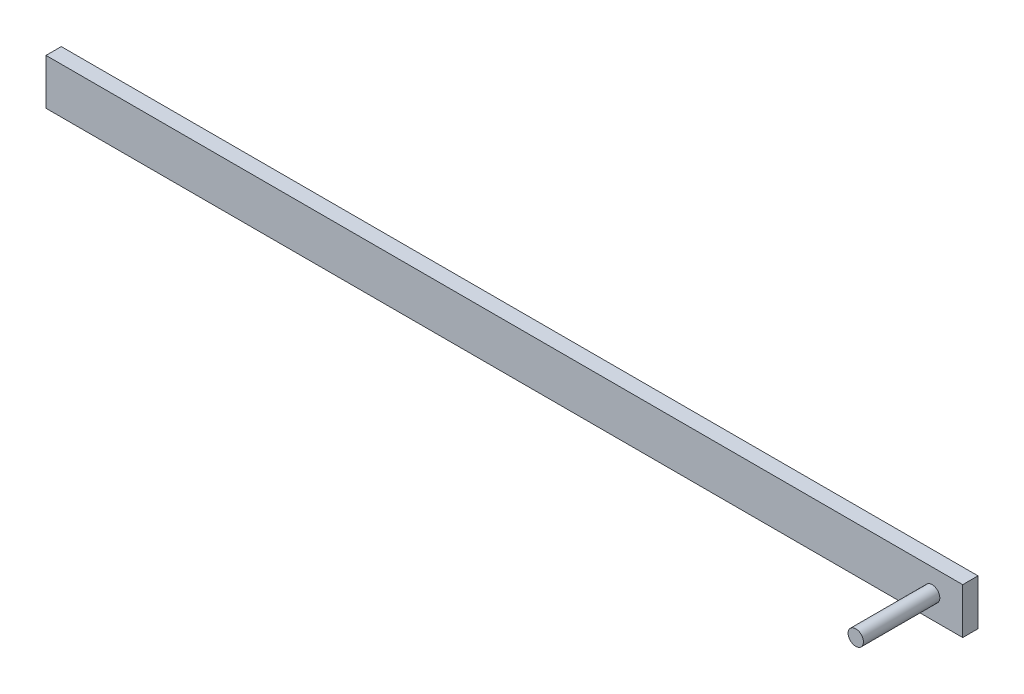
ISO-10303-21;
HEADER;
FILE_DESCRIPTION(('STEP AP214'),'2;1');
FILE_NAME('part.step','',(''),(''),'','','');
FILE_SCHEMA(('AUTOMOTIVE_DESIGN { 1 0 10303 214 1 1 1 1 }'));
ENDSEC;
DATA;
#1=APPLICATION_CONTEXT('core data for automotive mechanical design processes');
#2=APPLICATION_PROTOCOL_DEFINITION('international standard','automotive_design',2000,#1);
#3=PRODUCT_CONTEXT('',#1,'mechanical');
#4=PRODUCT('Part','Part','',(#3));
#5=PRODUCT_RELATED_PRODUCT_CATEGORY('part','',(#4));
#6=PRODUCT_DEFINITION_FORMATION('','',#4);
#7=PRODUCT_DEFINITION_CONTEXT('part definition',#1,'design');
#8=PRODUCT_DEFINITION('design','',#6,#7);
#9=PRODUCT_DEFINITION_SHAPE('','',#8);
#10=(LENGTH_UNIT() NAMED_UNIT(*) SI_UNIT(.MILLI.,.METRE.));
#11=(NAMED_UNIT(*) PLANE_ANGLE_UNIT() SI_UNIT($,.RADIAN.));
#12=(NAMED_UNIT(*) SI_UNIT($,.STERADIAN.) SOLID_ANGLE_UNIT());
#13=UNCERTAINTY_MEASURE_WITH_UNIT(LENGTH_MEASURE(1.E-05),#10,'distance_accuracy_value','');
#14=(GEOMETRIC_REPRESENTATION_CONTEXT(3) GLOBAL_UNCERTAINTY_ASSIGNED_CONTEXT((#13)) GLOBAL_UNIT_ASSIGNED_CONTEXT((#10,
#11,#12)) REPRESENTATION_CONTEXT('',''));
#15=CARTESIAN_POINT('',(0.,0.,0.));
#16=DIRECTION('',(0.,0.,1.));
#17=DIRECTION('',(1.,0.,0.));
#18=AXIS2_PLACEMENT_3D('',#15,#16,#17);
#19=CARTESIAN_POINT('',(-300.,-15.,10.));
#20=DIRECTION('',(0.,1.,0.));
#21=DIRECTION('',(0.,0.,1.));
#22=AXIS2_PLACEMENT_3D('',#19,#20,#21);
#23=PLANE('',#22);
#24=DIRECTION('',(1.,0.,0.));
#25=VECTOR('',#24,1.);
#26=CARTESIAN_POINT('',(-300.,-15.,0.));
#27=LINE('',#26,#25);
#28=CARTESIAN_POINT('',(-300.,-15.,0.));
#29=VERTEX_POINT('',#28);
#30=CARTESIAN_POINT('',(300.,-15.,0.));
#31=VERTEX_POINT('',#30);
#32=EDGE_CURVE('E109',#29,#31,#27,.T.);
#33=ORIENTED_EDGE('',*,*,#32,.T.);
#34=DIRECTION('',(0.,0.,-1.));
#35=VECTOR('',#34,1.);
#36=CARTESIAN_POINT('',(300.,-15.,10.));
#37=LINE('',#36,#35);
#38=CARTESIAN_POINT('',(300.,-15.,10.));
#39=VERTEX_POINT('',#38);
#40=EDGE_CURVE('E11',#39,#31,#37,.T.);
#41=ORIENTED_EDGE('',*,*,#40,.F.);
#42=DIRECTION('',(1.,0.,0.));
#43=VECTOR('',#42,1.);
#44=CARTESIAN_POINT('',(-300.,-15.,10.));
#45=LINE('',#44,#43);
#46=CARTESIAN_POINT('',(-300.,-15.,10.));
#47=VERTEX_POINT('',#46);
#48=EDGE_CURVE('E93',#47,#39,#45,.T.);
#49=ORIENTED_EDGE('',*,*,#48,.F.);
#50=DIRECTION('',(0.,0.,-1.));
#51=VECTOR('',#50,1.);
#52=CARTESIAN_POINT('',(-300.,-15.,10.));
#53=LINE('',#52,#51);
#54=EDGE_CURVE('E105',#47,#29,#53,.T.);
#55=ORIENTED_EDGE('',*,*,#54,.T.);
#56=EDGE_LOOP('',(#33,#41,#49,#55));
#57=FACE_BOUND('',#56,.T.);
#58=ADVANCED_FACE('F41',(#57),#23,.F.);
#59=CARTESIAN_POINT('',(300.,-15.,10.));
#60=DIRECTION('',(-1.,0.,0.));
#61=DIRECTION('',(0.,0.,1.));
#62=AXIS2_PLACEMENT_3D('',#59,#60,#61);
#63=PLANE('',#62);
#64=DIRECTION('',(0.,1.,0.));
#65=VECTOR('',#64,1.);
#66=CARTESIAN_POINT('',(300.,-15.,0.));
#67=LINE('',#66,#65);
#68=CARTESIAN_POINT('',(300.,15.,0.));
#69=VERTEX_POINT('',#68);
#70=EDGE_CURVE('E98',#31,#69,#67,.T.);
#71=ORIENTED_EDGE('',*,*,#70,.T.);
#72=DIRECTION('',(0.,0.,-1.));
#73=VECTOR('',#72,1.);
#74=CARTESIAN_POINT('',(300.,15.,10.));
#75=LINE('',#74,#73);
#76=CARTESIAN_POINT('',(300.,15.,10.));
#77=VERTEX_POINT('',#76);
#78=EDGE_CURVE('E50',#77,#69,#75,.T.);
#79=ORIENTED_EDGE('',*,*,#78,.F.);
#80=DIRECTION('',(0.,1.,0.));
#81=VECTOR('',#80,1.);
#82=CARTESIAN_POINT('',(300.,-15.,10.));
#83=LINE('',#82,#81);
#84=EDGE_CURVE('E88',#39,#77,#83,.T.);
#85=ORIENTED_EDGE('',*,*,#84,.F.);
#86=ORIENTED_EDGE('',*,*,#40,.T.);
#87=EDGE_LOOP('',(#71,#79,#85,#86));
#88=FACE_BOUND('',#87,.T.);
#89=ADVANCED_FACE('F97',(#88),#63,.F.);
#90=CARTESIAN_POINT('',(-300.,15.,10.));
#91=DIRECTION('',(0.,-1.,0.));
#92=DIRECTION('',(0.,0.,-1.));
#93=AXIS2_PLACEMENT_3D('',#90,#91,#92);
#94=PLANE('',#93);
#95=DIRECTION('',(-1.,0.,0.));
#96=VECTOR('',#95,1.);
#97=CARTESIAN_POINT('',(-300.,15.,0.));
#98=LINE('',#97,#96);
#99=CARTESIAN_POINT('',(-300.,15.,0.));
#100=VERTEX_POINT('',#99);
#101=EDGE_CURVE('E75',#69,#100,#98,.T.);
#102=ORIENTED_EDGE('',*,*,#101,.T.);
#103=DIRECTION('',(0.,0.,-1.));
#104=VECTOR('',#103,1.);
#105=CARTESIAN_POINT('',(-300.,15.,10.));
#106=LINE('',#105,#104);
#107=CARTESIAN_POINT('',(-300.,15.,10.));
#108=VERTEX_POINT('',#107);
#109=EDGE_CURVE('E100',#108,#100,#106,.T.);
#110=ORIENTED_EDGE('',*,*,#109,.F.);
#111=DIRECTION('',(-1.,0.,0.));
#112=VECTOR('',#111,1.);
#113=CARTESIAN_POINT('',(-300.,15.,10.));
#114=LINE('',#113,#112);
#115=EDGE_CURVE('E91',#77,#108,#114,.T.);
#116=ORIENTED_EDGE('',*,*,#115,.F.);
#117=ORIENTED_EDGE('',*,*,#78,.T.);
#118=EDGE_LOOP('',(#102,#110,#116,#117));
#119=FACE_BOUND('',#118,.T.);
#120=ADVANCED_FACE('F101',(#119),#94,.F.);
#121=CARTESIAN_POINT('',(-300.,-15.,10.));
#122=DIRECTION('',(1.,0.,0.));
#123=DIRECTION('',(0.,0.,-1.));
#124=AXIS2_PLACEMENT_3D('',#121,#122,#123);
#125=PLANE('',#124);
#126=DIRECTION('',(0.,-1.,0.));
#127=VECTOR('',#126,1.);
#128=CARTESIAN_POINT('',(-300.,-15.,0.));
#129=LINE('',#128,#127);
#130=EDGE_CURVE('E81',#100,#29,#129,.T.);
#131=ORIENTED_EDGE('',*,*,#130,.T.);
#132=ORIENTED_EDGE('',*,*,#54,.F.);
#133=DIRECTION('',(0.,-1.,0.));
#134=VECTOR('',#133,1.);
#135=CARTESIAN_POINT('',(-300.,-15.,10.));
#136=LINE('',#135,#134);
#137=EDGE_CURVE('E58',#108,#47,#136,.T.);
#138=ORIENTED_EDGE('',*,*,#137,.F.);
#139=ORIENTED_EDGE('',*,*,#109,.T.);
#140=EDGE_LOOP('',(#131,#132,#138,#139));
#141=FACE_BOUND('',#140,.T.);
#142=ADVANCED_FACE('F123',(#141),#125,.F.);
#143=CARTESIAN_POINT('',(0.,0.,10.));
#144=DIRECTION('',(0.,0.,1.));
#145=DIRECTION('',(1.,0.,0.));
#146=AXIS2_PLACEMENT_3D('',#143,#144,#145);
#147=PLANE('',#146);
#148=CARTESIAN_POINT('',(280.,0.,10.));
#149=DIRECTION('',(0.,0.,1.));
#150=DIRECTION('',(1.,0.,0.));
#151=AXIS2_PLACEMENT_3D('',#148,#149,#150);
#152=CIRCLE('',#151,4.99999999999999);
#153=CARTESIAN_POINT('',(285.,0.,10.));
#154=VERTEX_POINT('',#153);
#155=EDGE_CURVE('E130',#154,#154,#152,.T.);
#156=ORIENTED_EDGE('',*,*,#155,.F.);
#157=EDGE_LOOP('',(#156));
#158=FACE_BOUND('',#157,.T.);
#159=ORIENTED_EDGE('',*,*,#48,.T.);
#160=ORIENTED_EDGE('',*,*,#84,.T.);
#161=ORIENTED_EDGE('',*,*,#115,.T.);
#162=ORIENTED_EDGE('',*,*,#137,.T.);
#163=EDGE_LOOP('',(#159,#160,#161,#162));
#164=FACE_BOUND('',#163,.T.);
#165=ADVANCED_FACE('F89',(#158,#164),#147,.T.);
#166=CARTESIAN_POINT('',(0.,0.,0.));
#167=DIRECTION('',(0.,0.,1.));
#168=DIRECTION('',(1.,0.,0.));
#169=AXIS2_PLACEMENT_3D('',#166,#167,#168);
#170=PLANE('',#169);
#171=ORIENTED_EDGE('',*,*,#32,.F.);
#172=ORIENTED_EDGE('',*,*,#130,.F.);
#173=ORIENTED_EDGE('',*,*,#101,.F.);
#174=ORIENTED_EDGE('',*,*,#70,.F.);
#175=EDGE_LOOP('',(#171,#172,#173,#174));
#176=FACE_BOUND('',#175,.T.);
#177=ADVANCED_FACE('F126',(#176),#170,.F.);
#178=CARTESIAN_POINT('',(280.,0.,60.));
#179=DIRECTION('',(0.,0.,-1.));
#180=DIRECTION('',(-1.,0.,0.));
#181=AXIS2_PLACEMENT_3D('',#178,#179,#180);
#182=CYLINDRICAL_SURFACE('',#181,4.99999999999999);
#183=CARTESIAN_POINT('',(280.,0.,60.));
#184=DIRECTION('',(0.,0.,1.));
#185=DIRECTION('',(1.,0.,0.));
#186=AXIS2_PLACEMENT_3D('',#183,#184,#185);
#187=CIRCLE('',#186,4.99999999999999);
#188=CARTESIAN_POINT('',(285.,0.,60.));
#189=VERTEX_POINT('',#188);
#190=EDGE_CURVE('E113',#189,#189,#187,.T.);
#191=ORIENTED_EDGE('',*,*,#190,.F.);
#192=EDGE_LOOP('',(#191));
#193=FACE_BOUND('',#192,.T.);
#194=ORIENTED_EDGE('',*,*,#155,.T.);
#195=EDGE_LOOP('',(#194));
#196=FACE_BOUND('',#195,.T.);
#197=ADVANCED_FACE('F140',(#193,#196),#182,.T.);
#198=CARTESIAN_POINT('',(0.,0.,60.));
#199=DIRECTION('',(0.,0.,1.));
#200=DIRECTION('',(1.,0.,0.));
#201=AXIS2_PLACEMENT_3D('',#198,#199,#200);
#202=PLANE('',#201);
#203=ORIENTED_EDGE('',*,*,#190,.T.);
#204=EDGE_LOOP('',(#203));
#205=FACE_BOUND('',#204,.T.);
#206=ADVANCED_FACE('F138',(#205),#202,.T.);
#207=CLOSED_SHELL('',(#58,#89,#120,#142,#165,#177,#197,#206));
#208=MANIFOLD_SOLID_BREP('B2',#207);
#209=ADVANCED_BREP_SHAPE_REPRESENTATION('',(#18,#208),#14);
#210=SHAPE_DEFINITION_REPRESENTATION(#9,#209);
ENDSEC;
END-ISO-10303-21;
